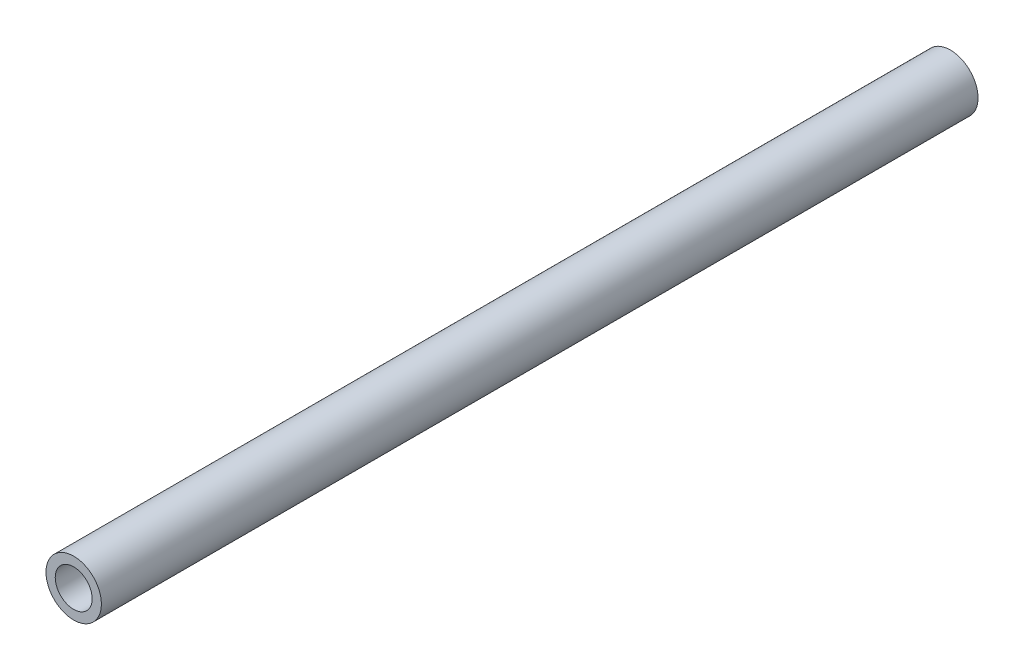
ISO-10303-21;
HEADER;
FILE_DESCRIPTION(('STEP AP214'),'2;1');
FILE_NAME('part.step','',(''),(''),'','','');
FILE_SCHEMA(('AUTOMOTIVE_DESIGN { 1 0 10303 214 1 1 1 1 }'));
ENDSEC;
DATA;
#1=APPLICATION_CONTEXT('core data for automotive mechanical design processes');
#2=APPLICATION_PROTOCOL_DEFINITION('international standard','automotive_design',2000,#1);
#3=PRODUCT_CONTEXT('',#1,'mechanical');
#4=PRODUCT('Part','Part','',(#3));
#5=PRODUCT_RELATED_PRODUCT_CATEGORY('part','',(#4));
#6=PRODUCT_DEFINITION_FORMATION('','',#4);
#7=PRODUCT_DEFINITION_CONTEXT('part definition',#1,'design');
#8=PRODUCT_DEFINITION('design','',#6,#7);
#9=PRODUCT_DEFINITION_SHAPE('','',#8);
#10=(LENGTH_UNIT() NAMED_UNIT(*) SI_UNIT(.MILLI.,.METRE.));
#11=(NAMED_UNIT(*) PLANE_ANGLE_UNIT() SI_UNIT($,.RADIAN.));
#12=(NAMED_UNIT(*) SI_UNIT($,.STERADIAN.) SOLID_ANGLE_UNIT());
#13=UNCERTAINTY_MEASURE_WITH_UNIT(LENGTH_MEASURE(1.E-05),#10,'distance_accuracy_value','');
#14=(GEOMETRIC_REPRESENTATION_CONTEXT(3) GLOBAL_UNCERTAINTY_ASSIGNED_CONTEXT((#13)) GLOBAL_UNIT_ASSIGNED_CONTEXT((#10,
#11,#12)) REPRESENTATION_CONTEXT('',''));
#15=CARTESIAN_POINT('',(0.,0.,0.));
#16=DIRECTION('',(0.,0.,1.));
#17=DIRECTION('',(1.,0.,0.));
#18=AXIS2_PLACEMENT_3D('',#15,#16,#17);
#19=CARTESIAN_POINT('',(0.,0.,950.));
#20=DIRECTION('',(0.,0.,1.));
#21=DIRECTION('',(1.,0.,0.));
#22=AXIS2_PLACEMENT_3D('',#19,#20,#21);
#23=PLANE('',#22);
#24=CARTESIAN_POINT('',(0.,0.,950.));
#25=DIRECTION('',(0.,0.,1.));
#26=DIRECTION('',(1.,0.,0.));
#27=AXIS2_PLACEMENT_3D('',#24,#25,#26);
#28=CIRCLE('',#27,30.);
#29=CARTESIAN_POINT('',(-30.,0.,950.));
#30=VERTEX_POINT('',#29);
#31=EDGE_CURVE('E10',#30,#30,#28,.T.);
#32=ORIENTED_EDGE('',*,*,#31,.T.);
#33=EDGE_LOOP('',(#32));
#34=FACE_BOUND('',#33,.T.);
#35=CARTESIAN_POINT('',(0.,0.,950.));
#36=DIRECTION('',(0.,0.,1.));
#37=DIRECTION('',(1.,0.,0.));
#38=AXIS2_PLACEMENT_3D('',#35,#36,#37);
#39=CIRCLE('',#38,20.);
#40=CARTESIAN_POINT('',(-20.,0.,950.));
#41=VERTEX_POINT('',#40);
#42=EDGE_CURVE('E43',#41,#41,#39,.T.);
#43=ORIENTED_EDGE('',*,*,#42,.F.);
#44=EDGE_LOOP('',(#43));
#45=FACE_BOUND('',#44,.T.);
#46=ADVANCED_FACE('F32',(#34,#45),#23,.T.);
#47=CARTESIAN_POINT('',(0.,0.,0.));
#48=DIRECTION('',(0.,0.,1.));
#49=DIRECTION('',(1.,0.,0.));
#50=AXIS2_PLACEMENT_3D('',#47,#48,#49);
#51=PLANE('',#50);
#52=CARTESIAN_POINT('',(0.,0.,0.));
#53=DIRECTION('',(0.,0.,1.));
#54=DIRECTION('',(1.,0.,0.));
#55=AXIS2_PLACEMENT_3D('',#52,#53,#54);
#56=CIRCLE('',#55,30.);
#57=CARTESIAN_POINT('',(-30.,0.,-1.11022302462516E-13));
#58=VERTEX_POINT('',#57);
#59=EDGE_CURVE('E36',#58,#58,#56,.T.);
#60=ORIENTED_EDGE('',*,*,#59,.F.);
#61=EDGE_LOOP('',(#60));
#62=FACE_BOUND('',#61,.T.);
#63=CARTESIAN_POINT('',(0.,0.,0.));
#64=DIRECTION('',(0.,0.,1.));
#65=DIRECTION('',(1.,0.,0.));
#66=AXIS2_PLACEMENT_3D('',#63,#64,#65);
#67=CIRCLE('',#66,20.);
#68=CARTESIAN_POINT('',(-20.,0.,-1.11022302462516E-13));
#69=VERTEX_POINT('',#68);
#70=EDGE_CURVE('E45',#69,#69,#67,.T.);
#71=ORIENTED_EDGE('',*,*,#70,.T.);
#72=EDGE_LOOP('',(#71));
#73=FACE_BOUND('',#72,.T.);
#74=ADVANCED_FACE('F55',(#62,#73),#51,.F.);
#75=CARTESIAN_POINT('',(0.,0.,950.));
#76=DIRECTION('',(0.,0.,-1.));
#77=DIRECTION('',(-1.,0.,0.));
#78=AXIS2_PLACEMENT_3D('',#75,#76,#77);
#79=CYLINDRICAL_SURFACE('',#78,30.);
#80=CARTESIAN_POINT('',(-30.,0.,950.));
#81=CARTESIAN_POINT('',(-30.,0.,940.104166666667));
#82=CARTESIAN_POINT('',(-30.,0.,930.208333333333));
#83=CARTESIAN_POINT('',(-30.,0.,910.416666666667));
#84=CARTESIAN_POINT('',(-30.,0.,900.520833333333));
#85=CARTESIAN_POINT('',(-30.,0.,880.729166666667));
#86=CARTESIAN_POINT('',(-30.,0.,870.833333333333));
#87=CARTESIAN_POINT('',(-30.,0.,851.041666666667));
#88=CARTESIAN_POINT('',(-30.,0.,841.145833333333));
#89=CARTESIAN_POINT('',(-30.,0.,821.354166666667));
#90=CARTESIAN_POINT('',(-30.,0.,811.458333333333));
#91=CARTESIAN_POINT('',(-30.,0.,791.666666666667));
#92=CARTESIAN_POINT('',(-30.,0.,781.770833333333));
#93=CARTESIAN_POINT('',(-30.,0.,761.979166666667));
#94=CARTESIAN_POINT('',(-30.,0.,752.083333333333));
#95=CARTESIAN_POINT('',(-30.,0.,732.291666666667));
#96=CARTESIAN_POINT('',(-30.,0.,722.395833333333));
#97=CARTESIAN_POINT('',(-30.,0.,702.604166666667));
#98=CARTESIAN_POINT('',(-30.,0.,692.708333333333));
#99=CARTESIAN_POINT('',(-30.,0.,672.916666666667));
#100=CARTESIAN_POINT('',(-30.,0.,663.020833333333));
#101=CARTESIAN_POINT('',(-30.,0.,643.229166666667));
#102=CARTESIAN_POINT('',(-30.,0.,633.333333333333));
#103=CARTESIAN_POINT('',(-30.,0.,613.541666666667));
#104=CARTESIAN_POINT('',(-30.,0.,603.645833333333));
#105=CARTESIAN_POINT('',(-30.,0.,583.854166666667));
#106=CARTESIAN_POINT('',(-30.,0.,573.958333333333));
#107=CARTESIAN_POINT('',(-30.,0.,554.166666666667));
#108=CARTESIAN_POINT('',(-30.,0.,544.270833333333));
#109=CARTESIAN_POINT('',(-30.,0.,524.479166666667));
#110=CARTESIAN_POINT('',(-30.,0.,514.583333333333));
#111=CARTESIAN_POINT('',(-30.,0.,494.791666666667));
#112=CARTESIAN_POINT('',(-30.,0.,484.895833333333));
#113=CARTESIAN_POINT('',(-30.,0.,465.104166666667));
#114=CARTESIAN_POINT('',(-30.,0.,455.208333333333));
#115=CARTESIAN_POINT('',(-30.,0.,435.416666666667));
#116=CARTESIAN_POINT('',(-30.,0.,425.520833333333));
#117=CARTESIAN_POINT('',(-30.,0.,405.729166666667));
#118=CARTESIAN_POINT('',(-30.,0.,395.833333333333));
#119=CARTESIAN_POINT('',(-30.,0.,376.041666666667));
#120=CARTESIAN_POINT('',(-30.,0.,366.145833333333));
#121=CARTESIAN_POINT('',(-30.,0.,346.354166666667));
#122=CARTESIAN_POINT('',(-30.,0.,336.458333333333));
#123=CARTESIAN_POINT('',(-30.,0.,316.666666666667));
#124=CARTESIAN_POINT('',(-30.,0.,306.770833333333));
#125=CARTESIAN_POINT('',(-30.,0.,286.979166666667));
#126=CARTESIAN_POINT('',(-30.,0.,277.083333333333));
#127=CARTESIAN_POINT('',(-30.,0.,257.291666666667));
#128=CARTESIAN_POINT('',(-30.,0.,247.395833333333));
#129=CARTESIAN_POINT('',(-30.,0.,227.604166666667));
#130=CARTESIAN_POINT('',(-30.,0.,217.708333333333));
#131=CARTESIAN_POINT('',(-30.,0.,197.916666666667));
#132=CARTESIAN_POINT('',(-30.,0.,188.020833333333));
#133=CARTESIAN_POINT('',(-30.,0.,168.229166666667));
#134=CARTESIAN_POINT('',(-30.,0.,158.333333333333));
#135=CARTESIAN_POINT('',(-30.,0.,138.541666666667));
#136=CARTESIAN_POINT('',(-30.,0.,128.645833333333));
#137=CARTESIAN_POINT('',(-30.,0.,108.854166666667));
#138=CARTESIAN_POINT('',(-30.,0.,98.9583333333333));
#139=CARTESIAN_POINT('',(-30.,0.,79.1666666666666));
#140=CARTESIAN_POINT('',(-30.,0.,69.2708333333332));
#141=CARTESIAN_POINT('',(-30.,0.,49.4791666666665));
#142=CARTESIAN_POINT('',(-30.,0.,39.5833333333332));
#143=CARTESIAN_POINT('',(-30.,0.,19.7916666666665));
#144=CARTESIAN_POINT('',(-30.,0.,9.89583333333321));
#145=CARTESIAN_POINT('',(-30.,0.,-1.11022302462516E-13));
#146=B_SPLINE_CURVE_WITH_KNOTS('',3,(#80,#81,#82,#83,#84,#85,#86,#87,#88,#89,#90,#91,#92,#93,
#94,#95,#96,#97,#98,#99,#100,#101,#102,#103,#104,#105,#106,#107,#108,#109,#110,#111,#112,#113,
#114,#115,#116,#117,#118,#119,#120,#121,#122,#123,#124,#125,#126,#127,#128,#129,#130,#131,#132,
#133,#134,#135,#136,#137,#138,#139,#140,#141,#142,#143,#144,#145),.UNSPECIFIED.,.F.,.F.,(4,2,2,
2,2,2,2,2,2,2,2,2,2,2,2,2,2,2,2,2,2,2,2,2,2,2,2,2,2,2,2,2,4),(0.,29.6875000000001,
59.3750000000001,89.0625,118.75,148.4375,178.125,207.8125,237.5,267.1875,296.875,326.5625,
356.25,385.9375,415.625,445.3125,475.,504.6875,534.375,564.0625,593.75,623.4375,653.125,
682.8125,712.5,742.1875,771.875,801.5625,831.25,860.9375,890.625,920.3125,950.),.UNSPECIFIED.);
#147=EDGE_CURVE('BSEAM34',#30,#58,#146,.T.);
#148=ORIENTED_EDGE('',*,*,#31,.F.);
#149=ORIENTED_EDGE('',*,*,#59,.T.);
#150=ORIENTED_EDGE('',*,*,#147,.T.);
#151=ORIENTED_EDGE('',*,*,#147,.F.);
#152=EDGE_LOOP('',(#148,#150,#149,#151));
#153=FACE_BOUND('',#152,.T.);
#154=ADVANCED_FACE('F34',(#153),#79,.T.);
#155=CARTESIAN_POINT('',(0.,0.,950.));
#156=DIRECTION('',(0.,0.,-1.));
#157=DIRECTION('',(-1.,0.,0.));
#158=AXIS2_PLACEMENT_3D('',#155,#156,#157);
#159=CYLINDRICAL_SURFACE('',#158,20.);
#160=CARTESIAN_POINT('',(-20.,0.,950.));
#161=CARTESIAN_POINT('',(-20.,0.,940.104166666667));
#162=CARTESIAN_POINT('',(-20.,0.,930.208333333333));
#163=CARTESIAN_POINT('',(-20.,0.,910.416666666667));
#164=CARTESIAN_POINT('',(-20.,0.,900.520833333333));
#165=CARTESIAN_POINT('',(-20.,0.,880.729166666667));
#166=CARTESIAN_POINT('',(-20.,0.,870.833333333333));
#167=CARTESIAN_POINT('',(-20.,0.,851.041666666667));
#168=CARTESIAN_POINT('',(-20.,0.,841.145833333333));
#169=CARTESIAN_POINT('',(-20.,0.,821.354166666667));
#170=CARTESIAN_POINT('',(-20.,0.,811.458333333333));
#171=CARTESIAN_POINT('',(-20.,0.,791.666666666667));
#172=CARTESIAN_POINT('',(-20.,0.,781.770833333333));
#173=CARTESIAN_POINT('',(-20.,0.,761.979166666667));
#174=CARTESIAN_POINT('',(-20.,0.,752.083333333333));
#175=CARTESIAN_POINT('',(-20.,0.,732.291666666667));
#176=CARTESIAN_POINT('',(-20.,0.,722.395833333333));
#177=CARTESIAN_POINT('',(-20.,0.,702.604166666667));
#178=CARTESIAN_POINT('',(-20.,0.,692.708333333333));
#179=CARTESIAN_POINT('',(-20.,0.,672.916666666667));
#180=CARTESIAN_POINT('',(-20.,0.,663.020833333333));
#181=CARTESIAN_POINT('',(-20.,0.,643.229166666667));
#182=CARTESIAN_POINT('',(-20.,0.,633.333333333333));
#183=CARTESIAN_POINT('',(-20.,0.,613.541666666667));
#184=CARTESIAN_POINT('',(-20.,0.,603.645833333333));
#185=CARTESIAN_POINT('',(-20.,0.,583.854166666667));
#186=CARTESIAN_POINT('',(-20.,0.,573.958333333333));
#187=CARTESIAN_POINT('',(-20.,0.,554.166666666667));
#188=CARTESIAN_POINT('',(-20.,0.,544.270833333333));
#189=CARTESIAN_POINT('',(-20.,0.,524.479166666667));
#190=CARTESIAN_POINT('',(-20.,0.,514.583333333333));
#191=CARTESIAN_POINT('',(-20.,0.,494.791666666667));
#192=CARTESIAN_POINT('',(-20.,0.,484.895833333333));
#193=CARTESIAN_POINT('',(-20.,0.,465.104166666667));
#194=CARTESIAN_POINT('',(-20.,0.,455.208333333333));
#195=CARTESIAN_POINT('',(-20.,0.,435.416666666667));
#196=CARTESIAN_POINT('',(-20.,0.,425.520833333333));
#197=CARTESIAN_POINT('',(-20.,0.,405.729166666667));
#198=CARTESIAN_POINT('',(-20.,0.,395.833333333333));
#199=CARTESIAN_POINT('',(-20.,0.,376.041666666667));
#200=CARTESIAN_POINT('',(-20.,0.,366.145833333333));
#201=CARTESIAN_POINT('',(-20.,0.,346.354166666667));
#202=CARTESIAN_POINT('',(-20.,0.,336.458333333333));
#203=CARTESIAN_POINT('',(-20.,0.,316.666666666667));
#204=CARTESIAN_POINT('',(-20.,0.,306.770833333333));
#205=CARTESIAN_POINT('',(-20.,0.,286.979166666667));
#206=CARTESIAN_POINT('',(-20.,0.,277.083333333333));
#207=CARTESIAN_POINT('',(-20.,0.,257.291666666667));
#208=CARTESIAN_POINT('',(-20.,0.,247.395833333333));
#209=CARTESIAN_POINT('',(-20.,0.,227.604166666667));
#210=CARTESIAN_POINT('',(-20.,0.,217.708333333333));
#211=CARTESIAN_POINT('',(-20.,0.,197.916666666667));
#212=CARTESIAN_POINT('',(-20.,0.,188.020833333333));
#213=CARTESIAN_POINT('',(-20.,0.,168.229166666667));
#214=CARTESIAN_POINT('',(-20.,0.,158.333333333333));
#215=CARTESIAN_POINT('',(-20.,0.,138.541666666667));
#216=CARTESIAN_POINT('',(-20.,0.,128.645833333333));
#217=CARTESIAN_POINT('',(-20.,0.,108.854166666667));
#218=CARTESIAN_POINT('',(-20.,0.,98.9583333333333));
#219=CARTESIAN_POINT('',(-20.,0.,79.1666666666666));
#220=CARTESIAN_POINT('',(-20.,0.,69.2708333333332));
#221=CARTESIAN_POINT('',(-20.,0.,49.4791666666665));
#222=CARTESIAN_POINT('',(-20.,0.,39.5833333333332));
#223=CARTESIAN_POINT('',(-20.,0.,19.7916666666665));
#224=CARTESIAN_POINT('',(-20.,0.,9.89583333333321));
#225=CARTESIAN_POINT('',(-20.,0.,-1.11022302462516E-13));
#226=B_SPLINE_CURVE_WITH_KNOTS('',3,(#160,#161,#162,#163,#164,#165,#166,#167,#168,#169,#170,
#171,#172,#173,#174,#175,#176,#177,#178,#179,#180,#181,#182,#183,#184,#185,#186,#187,#188,#189,
#190,#191,#192,#193,#194,#195,#196,#197,#198,#199,#200,#201,#202,#203,#204,#205,#206,#207,#208,
#209,#210,#211,#212,#213,#214,#215,#216,#217,#218,#219,#220,#221,#222,#223,#224,#225),
.UNSPECIFIED.,.F.,.F.,(4,2,2,2,2,2,2,2,2,2,2,2,2,2,2,2,2,2,2,2,2,2,2,2,2,2,2,2,2,2,2,2,4),(0.,
29.6875,59.375,89.0624999999999,118.75,148.4375,178.125,207.8125,237.5,267.1875,296.875,
326.5625,356.25,385.9375,415.625,445.3125,475.,504.6875,534.375,564.0625,593.75,623.4375,
653.125,682.8125,712.5,742.1875,771.875,801.5625,831.25,860.9375,890.625,920.3125,950.),.UNSPECIFIED.);
#227=EDGE_CURVE('BSEAM51',#41,#69,#226,.T.);
#228=ORIENTED_EDGE('',*,*,#42,.T.);
#229=ORIENTED_EDGE('',*,*,#70,.F.);
#230=ORIENTED_EDGE('',*,*,#227,.T.);
#231=ORIENTED_EDGE('',*,*,#227,.F.);
#232=EDGE_LOOP('',(#228,#230,#229,#231));
#233=FACE_BOUND('',#232,.T.);
#234=ADVANCED_FACE('F51',(#233),#159,.F.);
#235=CLOSED_SHELL('',(#46,#74,#154,#234));
#236=MANIFOLD_SOLID_BREP('B2',#235);
#237=ADVANCED_BREP_SHAPE_REPRESENTATION('',(#18,#236),#14);
#238=SHAPE_DEFINITION_REPRESENTATION(#9,#237);
ENDSEC;
END-ISO-10303-21;
